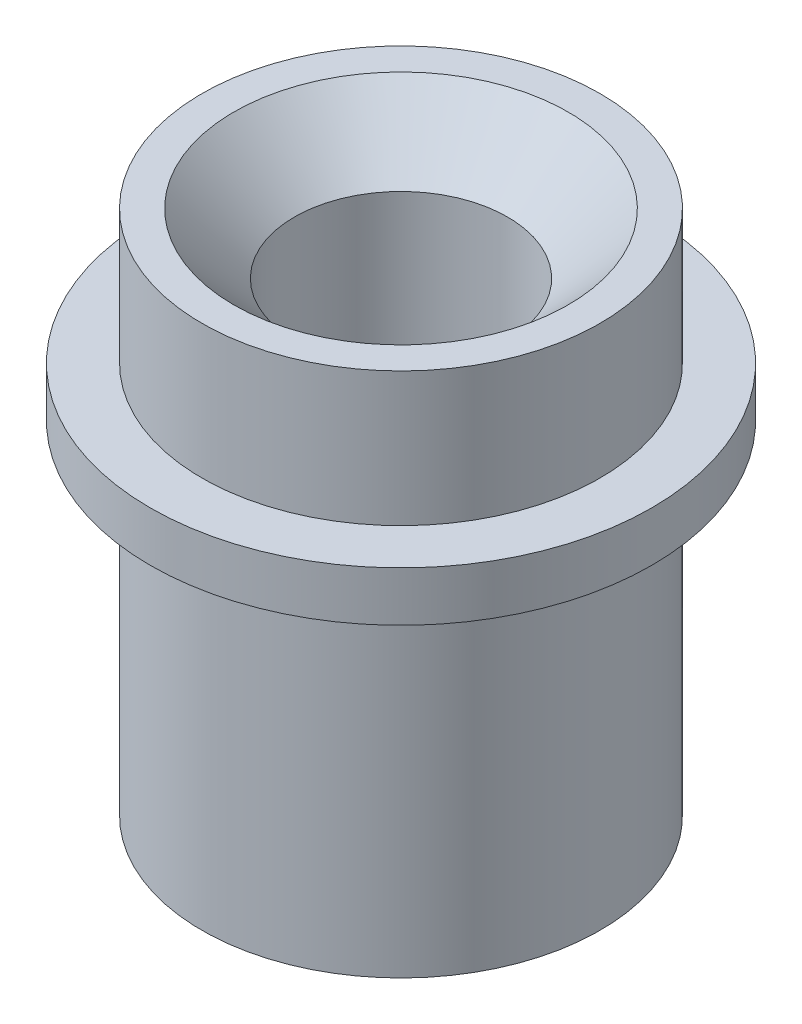
ISO-10303-21;
HEADER;
FILE_DESCRIPTION(('STEP AP214'),'2;1');
FILE_NAME('part.step','',(''),(''),'','','');
FILE_SCHEMA(('AUTOMOTIVE_DESIGN { 1 0 10303 214 1 1 1 1 }'));
ENDSEC;
DATA;
#1=APPLICATION_CONTEXT('core data for automotive mechanical design processes');
#2=APPLICATION_PROTOCOL_DEFINITION('international standard','automotive_design',2000,#1);
#3=PRODUCT_CONTEXT('',#1,'mechanical');
#4=PRODUCT('Part','Part','',(#3));
#5=PRODUCT_RELATED_PRODUCT_CATEGORY('part','',(#4));
#6=PRODUCT_DEFINITION_FORMATION('','',#4);
#7=PRODUCT_DEFINITION_CONTEXT('part definition',#1,'design');
#8=PRODUCT_DEFINITION('design','',#6,#7);
#9=PRODUCT_DEFINITION_SHAPE('','',#8);
#10=(LENGTH_UNIT() NAMED_UNIT(*) SI_UNIT(.MILLI.,.METRE.));
#11=(NAMED_UNIT(*) PLANE_ANGLE_UNIT() SI_UNIT($,.RADIAN.));
#12=(NAMED_UNIT(*) SI_UNIT($,.STERADIAN.) SOLID_ANGLE_UNIT());
#13=UNCERTAINTY_MEASURE_WITH_UNIT(LENGTH_MEASURE(1.E-05),#10,'distance_accuracy_value','');
#14=(GEOMETRIC_REPRESENTATION_CONTEXT(3) GLOBAL_UNCERTAINTY_ASSIGNED_CONTEXT((#13)) GLOBAL_UNIT_ASSIGNED_CONTEXT((#10,
#11,#12)) REPRESENTATION_CONTEXT('',''));
#15=CARTESIAN_POINT('',(0.,0.,0.));
#16=DIRECTION('',(0.,0.,1.));
#17=DIRECTION('',(1.,0.,0.));
#18=AXIS2_PLACEMENT_3D('',#15,#16,#17);
#19=CARTESIAN_POINT('',(0.,0.,0.));
#20=DIRECTION('',(0.,-1.,0.));
#21=DIRECTION('',(0.,0.,-1.));
#22=AXIS2_PLACEMENT_3D('',#19,#20,#21);
#23=PLANE('',#22);
#24=CARTESIAN_POINT('',(0.,0.,0.));
#25=DIRECTION('',(0.,1.,0.));
#26=DIRECTION('',(0.,0.,1.));
#27=AXIS2_PLACEMENT_3D('',#24,#25,#26);
#28=CIRCLE('',#27,2.62);
#29=CARTESIAN_POINT('',(0.,0.,2.62));
#30=VERTEX_POINT('',#29);
#31=EDGE_CURVE('E64',#30,#30,#28,.T.);
#32=ORIENTED_EDGE('',*,*,#31,.T.);
#33=EDGE_LOOP('',(#32));
#34=FACE_BOUND('',#33,.T.);
#35=CARTESIAN_POINT('',(0.,0.,0.));
#36=DIRECTION('',(0.,-1.,0.));
#37=DIRECTION('',(0.,0.,-1.));
#38=AXIS2_PLACEMENT_3D('',#35,#36,#37);
#39=CIRCLE('',#38,3.12);
#40=CARTESIAN_POINT('',(0.,0.,-3.12));
#41=VERTEX_POINT('',#40);
#42=EDGE_CURVE('E10',#41,#41,#39,.T.);
#43=ORIENTED_EDGE('',*,*,#42,.T.);
#44=EDGE_LOOP('',(#43));
#45=FACE_BOUND('',#44,.T.);
#46=ADVANCED_FACE('F35',(#34,#45),#23,.T.);
#47=CARTESIAN_POINT('',(0.,0.,0.));
#48=DIRECTION('',(0.,-1.,0.));
#49=DIRECTION('',(0.,0.,-1.));
#50=AXIS2_PLACEMENT_3D('',#47,#48,#49);
#51=CYLINDRICAL_SURFACE('',#50,3.12);
#52=CARTESIAN_POINT('',(0.,5.36,0.));
#53=DIRECTION('',(0.,-1.,0.));
#54=DIRECTION('',(0.,0.,-1.));
#55=AXIS2_PLACEMENT_3D('',#52,#53,#54);
#56=CIRCLE('',#55,3.12);
#57=CARTESIAN_POINT('',(0.,5.36,-3.12));
#58=VERTEX_POINT('',#57);
#59=EDGE_CURVE('E41',#58,#58,#56,.T.);
#60=ORIENTED_EDGE('',*,*,#59,.T.);
#61=EDGE_LOOP('',(#60));
#62=FACE_BOUND('',#61,.T.);
#63=ORIENTED_EDGE('',*,*,#42,.F.);
#64=EDGE_LOOP('',(#63));
#65=FACE_BOUND('',#64,.T.);
#66=ADVANCED_FACE('F90',(#62,#65),#51,.T.);
#67=CARTESIAN_POINT('',(3.12,5.36,0.));
#68=DIRECTION('',(0.,-1.,0.));
#69=DIRECTION('',(0.,0.,-1.));
#70=AXIS2_PLACEMENT_3D('',#67,#68,#69);
#71=PLANE('',#70);
#72=CARTESIAN_POINT('',(0.,5.36,0.));
#73=DIRECTION('',(0.,-1.,0.));
#74=DIRECTION('',(0.,0.,-1.));
#75=AXIS2_PLACEMENT_3D('',#72,#73,#74);
#76=CIRCLE('',#75,3.93);
#77=CARTESIAN_POINT('',(0.,5.36,-3.93));
#78=VERTEX_POINT('',#77);
#79=EDGE_CURVE('E45',#78,#78,#76,.T.);
#80=ORIENTED_EDGE('',*,*,#79,.T.);
#81=EDGE_LOOP('',(#80));
#82=FACE_BOUND('',#81,.T.);
#83=ORIENTED_EDGE('',*,*,#59,.F.);
#84=EDGE_LOOP('',(#83));
#85=FACE_BOUND('',#84,.T.);
#86=ADVANCED_FACE('F94',(#82,#85),#71,.T.);
#87=CARTESIAN_POINT('',(0.,0.,0.));
#88=DIRECTION('',(0.,-1.,0.));
#89=DIRECTION('',(0.,0.,-1.));
#90=AXIS2_PLACEMENT_3D('',#87,#88,#89);
#91=CYLINDRICAL_SURFACE('',#90,3.93);
#92=CARTESIAN_POINT('',(0.,6.14,0.));
#93=DIRECTION('',(0.,-1.,0.));
#94=DIRECTION('',(0.,0.,-1.));
#95=AXIS2_PLACEMENT_3D('',#92,#93,#94);
#96=CIRCLE('',#95,3.93);
#97=CARTESIAN_POINT('',(0.,6.14,-3.93));
#98=VERTEX_POINT('',#97);
#99=EDGE_CURVE('E49',#98,#98,#96,.T.);
#100=ORIENTED_EDGE('',*,*,#99,.T.);
#101=EDGE_LOOP('',(#100));
#102=FACE_BOUND('',#101,.T.);
#103=ORIENTED_EDGE('',*,*,#79,.F.);
#104=EDGE_LOOP('',(#103));
#105=FACE_BOUND('',#104,.T.);
#106=ADVANCED_FACE('F98',(#102,#105),#91,.T.);
#107=CARTESIAN_POINT('',(3.93,6.14,0.));
#108=DIRECTION('',(0.,1.,0.));
#109=DIRECTION('',(0.,0.,1.));
#110=AXIS2_PLACEMENT_3D('',#107,#108,#109);
#111=PLANE('',#110);
#112=CARTESIAN_POINT('',(0.,6.14,0.));
#113=DIRECTION('',(0.,-1.,0.));
#114=DIRECTION('',(0.,0.,-1.));
#115=AXIS2_PLACEMENT_3D('',#112,#113,#114);
#116=CIRCLE('',#115,3.12);
#117=CARTESIAN_POINT('',(0.,6.14,-3.12));
#118=VERTEX_POINT('',#117);
#119=EDGE_CURVE('E54',#118,#118,#116,.T.);
#120=ORIENTED_EDGE('',*,*,#119,.T.);
#121=EDGE_LOOP('',(#120));
#122=FACE_BOUND('',#121,.T.);
#123=ORIENTED_EDGE('',*,*,#99,.F.);
#124=EDGE_LOOP('',(#123));
#125=FACE_BOUND('',#124,.T.);
#126=ADVANCED_FACE('F105',(#122,#125),#111,.T.);
#127=CARTESIAN_POINT('',(0.,0.,0.));
#128=DIRECTION('',(0.,-1.,0.));
#129=DIRECTION('',(0.,0.,-1.));
#130=AXIS2_PLACEMENT_3D('',#127,#128,#129);
#131=CYLINDRICAL_SURFACE('',#130,3.12);
#132=CARTESIAN_POINT('',(0.,8.24,0.));
#133=DIRECTION('',(0.,-1.,0.));
#134=DIRECTION('',(0.,0.,-1.));
#135=AXIS2_PLACEMENT_3D('',#132,#133,#134);
#136=CIRCLE('',#135,3.12);
#137=CARTESIAN_POINT('',(0.,8.24,-3.12));
#138=VERTEX_POINT('',#137);
#139=EDGE_CURVE('E57',#138,#138,#136,.T.);
#140=ORIENTED_EDGE('',*,*,#139,.T.);
#141=EDGE_LOOP('',(#140));
#142=FACE_BOUND('',#141,.T.);
#143=ORIENTED_EDGE('',*,*,#119,.F.);
#144=EDGE_LOOP('',(#143));
#145=FACE_BOUND('',#144,.T.);
#146=ADVANCED_FACE('F109',(#142,#145),#131,.T.);
#147=CARTESIAN_POINT('',(3.12,8.24,0.));
#148=DIRECTION('',(0.,1.,0.));
#149=DIRECTION('',(0.,0.,1.));
#150=AXIS2_PLACEMENT_3D('',#147,#148,#149);
#151=PLANE('',#150);
#152=CARTESIAN_POINT('',(0.,8.24,0.));
#153=DIRECTION('',(0.,1.,0.));
#154=DIRECTION('',(0.,0.,1.));
#155=AXIS2_PLACEMENT_3D('',#152,#153,#154);
#156=CIRCLE('',#155,2.62);
#157=CARTESIAN_POINT('',(0.,8.24,2.62));
#158=VERTEX_POINT('',#157);
#159=EDGE_CURVE('E65',#158,#158,#156,.T.);
#160=ORIENTED_EDGE('',*,*,#159,.F.);
#161=EDGE_LOOP('',(#160));
#162=FACE_BOUND('',#161,.T.);
#163=ORIENTED_EDGE('',*,*,#139,.F.);
#164=EDGE_LOOP('',(#163));
#165=FACE_BOUND('',#164,.T.);
#166=ADVANCED_FACE('F86',(#162,#165),#151,.T.);
#167=CARTESIAN_POINT('',(0.,7.29000000000001,0.));
#168=DIRECTION('',(0.,1.,0.));
#169=DIRECTION('',(0.,0.,1.));
#170=AXIS2_PLACEMENT_3D('',#167,#168,#169);
#171=CONICAL_SURFACE('',#170,1.67,0.785398163397454);
#172=ORIENTED_EDGE('',*,*,#159,.T.);
#173=EDGE_LOOP('',(#172));
#174=FACE_BOUND('',#173,.T.);
#175=CARTESIAN_POINT('',(0.,7.29000000000001,0.));
#176=DIRECTION('',(0.,1.,0.));
#177=DIRECTION('',(0.,0.,1.));
#178=AXIS2_PLACEMENT_3D('',#175,#176,#177);
#179=CIRCLE('',#178,1.67);
#180=CARTESIAN_POINT('',(0.,7.29000000000001,1.67));
#181=VERTEX_POINT('',#180);
#182=EDGE_CURVE('E61',#181,#181,#179,.T.);
#183=ORIENTED_EDGE('',*,*,#182,.F.);
#184=EDGE_LOOP('',(#183));
#185=FACE_BOUND('',#184,.T.);
#186=ADVANCED_FACE('F77',(#174,#185),#171,.F.);
#187=CARTESIAN_POINT('',(0.,0.,0.));
#188=DIRECTION('',(0.,-1.,0.));
#189=DIRECTION('',(0.,0.,-1.));
#190=AXIS2_PLACEMENT_3D('',#187,#188,#189);
#191=CONICAL_SURFACE('',#190,2.62,0.785398163397454);
#192=CARTESIAN_POINT('',(0.,0.949999999999989,0.));
#193=DIRECTION('',(0.,1.,0.));
#194=DIRECTION('',(0.,0.,1.));
#195=AXIS2_PLACEMENT_3D('',#192,#193,#194);
#196=CIRCLE('',#195,1.67);
#197=CARTESIAN_POINT('',(0.,0.949999999999989,1.67));
#198=VERTEX_POINT('',#197);
#199=EDGE_CURVE('E60',#198,#198,#196,.T.);
#200=ORIENTED_EDGE('',*,*,#199,.T.);
#201=EDGE_LOOP('',(#200));
#202=FACE_BOUND('',#201,.T.);
#203=ORIENTED_EDGE('',*,*,#31,.F.);
#204=EDGE_LOOP('',(#203));
#205=FACE_BOUND('',#204,.T.);
#206=ADVANCED_FACE('F74',(#202,#205),#191,.F.);
#207=CARTESIAN_POINT('',(0.,8.24,0.));
#208=DIRECTION('',(0.,-1.,0.));
#209=DIRECTION('',(0.,0.,-1.));
#210=AXIS2_PLACEMENT_3D('',#207,#208,#209);
#211=CYLINDRICAL_SURFACE('',#210,1.67);
#212=ORIENTED_EDGE('',*,*,#182,.T.);
#213=EDGE_LOOP('',(#212));
#214=FACE_BOUND('',#213,.T.);
#215=ORIENTED_EDGE('',*,*,#199,.F.);
#216=EDGE_LOOP('',(#215));
#217=FACE_BOUND('',#216,.T.);
#218=ADVANCED_FACE('F76',(#214,#217),#211,.F.);
#219=CLOSED_SHELL('',(#46,#66,#86,#106,#126,#146,#166,#186,#206,#218));
#220=MANIFOLD_SOLID_BREP('B2',#219);
#221=ADVANCED_BREP_SHAPE_REPRESENTATION('',(#18,#220),#14);
#222=SHAPE_DEFINITION_REPRESENTATION(#9,#221);
ENDSEC;
END-ISO-10303-21;
